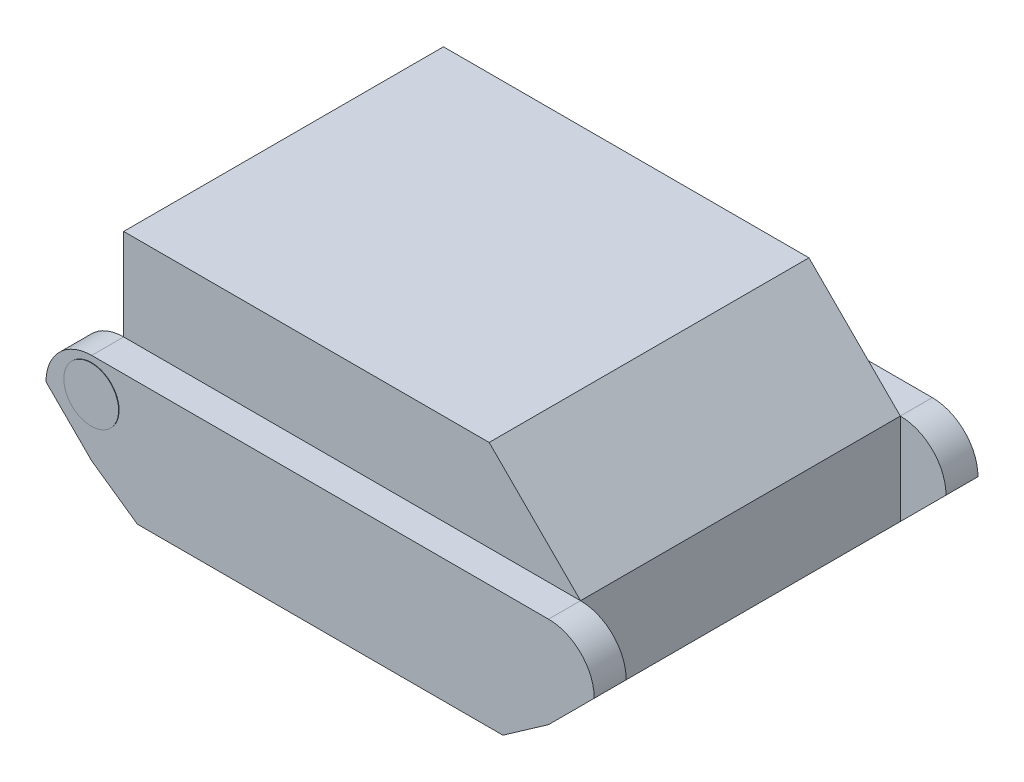
ISO-10303-21;
HEADER;
FILE_DESCRIPTION(('STEP AP214'),'2;1');
FILE_NAME('part.step','',(''),(''),'','','');
FILE_SCHEMA(('AUTOMOTIVE_DESIGN { 1 0 10303 214 1 1 1 1 }'));
ENDSEC;
DATA;
#1=APPLICATION_CONTEXT('core data for automotive mechanical design processes');
#2=APPLICATION_PROTOCOL_DEFINITION('international standard','automotive_design',2000,#1);
#3=PRODUCT_CONTEXT('',#1,'mechanical');
#4=PRODUCT('Part','Part','',(#3));
#5=PRODUCT_RELATED_PRODUCT_CATEGORY('part','',(#4));
#6=PRODUCT_DEFINITION_FORMATION('','',#4);
#7=PRODUCT_DEFINITION_CONTEXT('part definition',#1,'design');
#8=PRODUCT_DEFINITION('design','',#6,#7);
#9=PRODUCT_DEFINITION_SHAPE('','',#8);
#10=(LENGTH_UNIT() NAMED_UNIT(*) SI_UNIT(.MILLI.,.METRE.));
#11=(NAMED_UNIT(*) PLANE_ANGLE_UNIT() SI_UNIT($,.RADIAN.));
#12=(NAMED_UNIT(*) SI_UNIT($,.STERADIAN.) SOLID_ANGLE_UNIT());
#13=UNCERTAINTY_MEASURE_WITH_UNIT(LENGTH_MEASURE(1.E-05),#10,'distance_accuracy_value','');
#14=(GEOMETRIC_REPRESENTATION_CONTEXT(3) GLOBAL_UNCERTAINTY_ASSIGNED_CONTEXT((#13)) GLOBAL_UNIT_ASSIGNED_CONTEXT((#10,
#11,#12)) REPRESENTATION_CONTEXT('',''));
#15=CARTESIAN_POINT('',(0.,0.,0.));
#16=DIRECTION('',(0.,0.,1.));
#17=DIRECTION('',(1.,0.,0.));
#18=AXIS2_PLACEMENT_3D('',#15,#16,#17);
#19=CARTESIAN_POINT('',(-2.85897556390974,-98.560009332196,77.));
#20=DIRECTION('',(0.,0.,1.));
#21=DIRECTION('',(1.,0.,0.));
#22=AXIS2_PLACEMENT_3D('',#19,#20,#21);
#23=PLANE('',#22);
#24=DIRECTION('',(1.,0.,0.));
#25=VECTOR('',#24,1.);
#26=CARTESIAN_POINT('',(-2.85897556390974,-19.6239756367663,77.));
#27=LINE('',#26,#25);
#28=CARTESIAN_POINT('',(-42.8589755639098,-19.6239756367663,77.));
#29=VERTEX_POINT('',#28);
#30=CARTESIAN_POINT('',(37.1410244360903,-19.6239756367663,77.));
#31=VERTEX_POINT('',#30);
#32=EDGE_CURVE('E177',#29,#31,#27,.T.);
#33=ORIENTED_EDGE('',*,*,#32,.T.);
#34=DIRECTION('',(0.819231920519041,0.573462344363328,0.));
#35=VECTOR('',#34,1.);
#36=CARTESIAN_POINT('',(-26.7886558235076,-64.3747518184848,77.));
#37=LINE('',#36,#35);
#38=CARTESIAN_POINT('',(47.1410244360903,-12.6239756367663,77.));
#39=VERTEX_POINT('',#38);
#40=EDGE_CURVE('E165',#31,#39,#37,.T.);
#41=ORIENTED_EDGE('',*,*,#40,.T.);
#42=DIRECTION('',(0.707106781186548,0.707106781186548,0.));
#43=VECTOR('',#42,1.);
#44=CARTESIAN_POINT('',(-20.8269924116246,-80.5919924844812,77.));
#45=LINE('',#44,#43);
#46=CARTESIAN_POINT('',(57.1410244360903,-2.62397563676636,77.));
#47=VERTEX_POINT('',#46);
#48=EDGE_CURVE('E176',#39,#47,#45,.T.);
#49=ORIENTED_EDGE('',*,*,#48,.T.);
#50=CARTESIAN_POINT('',(47.1410244360903,-2.62397563676634,77.));
#51=DIRECTION('',(0.,0.,1.));
#52=DIRECTION('',(1.,0.,0.));
#53=AXIS2_PLACEMENT_3D('',#50,#51,#52);
#54=CIRCLE('',#53,10.);
#55=CARTESIAN_POINT('',(47.1410244360903,7.37602436323367,77.));
#56=VERTEX_POINT('',#55);
#57=EDGE_CURVE('E391',#56,#47,#54,.F.);
#58=ORIENTED_EDGE('',*,*,#57,.F.);
#59=DIRECTION('',(1.,0.,0.));
#60=VECTOR('',#59,1.);
#61=CARTESIAN_POINT('',(-2.85897556390974,7.37602436323366,77.));
#62=LINE('',#61,#60);
#63=CARTESIAN_POINT('',(-52.8589755639098,7.37602436323366,77.));
#64=VERTEX_POINT('',#63);
#65=EDGE_CURVE('E439',#64,#56,#62,.T.);
#66=ORIENTED_EDGE('',*,*,#65,.F.);
#67=CARTESIAN_POINT('',(-52.8589755639098,-2.62397563676634,77.));
#68=DIRECTION('',(0.,0.,1.));
#69=DIRECTION('',(1.,0.,0.));
#70=AXIS2_PLACEMENT_3D('',#67,#68,#69);
#71=CIRCLE('',#70,10.);
#72=CARTESIAN_POINT('',(-62.8589755639098,-2.62397563676635,77.));
#73=VERTEX_POINT('',#72);
#74=EDGE_CURVE('E442',#64,#73,#71,.T.);
#75=ORIENTED_EDGE('',*,*,#74,.T.);
#76=DIRECTION('',(0.707106781186548,-0.707106781186548,0.));
#77=VECTOR('',#76,1.);
#78=CARTESIAN_POINT('',(15.1090412838051,-80.5919924844812,77.));
#79=LINE('',#78,#77);
#80=CARTESIAN_POINT('',(-52.8589755639097,-12.6239756367663,77.));
#81=VERTEX_POINT('',#80);
#82=EDGE_CURVE('E444',#73,#81,#79,.T.);
#83=ORIENTED_EDGE('',*,*,#82,.T.);
#84=DIRECTION('',(0.81923192051904,-0.573462344363329,0.));
#85=VECTOR('',#84,1.);
#86=CARTESIAN_POINT('',(21.0707046956881,-64.3747518184849,77.));
#87=LINE('',#86,#85);
#88=EDGE_CURVE('E182',#81,#29,#87,.T.);
#89=ORIENTED_EDGE('',*,*,#88,.T.);
#90=EDGE_LOOP('',(#33,#41,#49,#58,#66,#75,#83,#89));
#91=FACE_BOUND('',#90,.T.);
#92=CARTESIAN_POINT('',(-52.8589755639098,0.,77.));
#93=DIRECTION('',(0.,0.,1.));
#94=DIRECTION('',(1.,0.,0.));
#95=AXIS2_PLACEMENT_3D('',#92,#93,#94);
#96=CIRCLE('',#95,5.9977823607704);
#97=CARTESIAN_POINT('',(-46.8611932031394,0.,77.));
#98=VERTEX_POINT('',#97);
#99=EDGE_CURVE('E431',#98,#98,#96,.T.);
#100=ORIENTED_EDGE('',*,*,#99,.F.);
#101=EDGE_LOOP('',(#100));
#102=FACE_BOUND('',#101,.T.);
#103=ADVANCED_FACE('F39',(#91,#102),#23,.T.);
#104=CARTESIAN_POINT('',(-52.8589755639097,-12.6239756367663,70.));
#105=DIRECTION('',(0.,0.,1.));
#106=DIRECTION('',(1.,0.,0.));
#107=AXIS2_PLACEMENT_3D('',#104,#105,#106);
#108=PLANE('',#107);
#109=DIRECTION('',(0.,-1.,0.));
#110=VECTOR('',#109,1.);
#111=CARTESIAN_POINT('',(-52.8589755639098,27.3760243632337,70.));
#112=LINE('',#111,#110);
#113=CARTESIAN_POINT('',(-52.8589755639098,27.3760243632337,70.));
#114=VERTEX_POINT('',#113);
#115=CARTESIAN_POINT('',(-52.8589755639098,7.37602436323366,70.));
#116=VERTEX_POINT('',#115);
#117=EDGE_CURVE('E265',#114,#116,#112,.T.);
#118=ORIENTED_EDGE('',*,*,#117,.T.);
#119=DIRECTION('',(1.,0.,0.));
#120=VECTOR('',#119,1.);
#121=CARTESIAN_POINT('',(-2.85897556390974,7.37602436323366,70.));
#122=LINE('',#121,#120);
#123=CARTESIAN_POINT('',(47.1410244360903,7.37602436323367,70.));
#124=VERTEX_POINT('',#123);
#125=EDGE_CURVE('E358',#116,#124,#122,.T.);
#126=ORIENTED_EDGE('',*,*,#125,.T.);
#127=DIRECTION('',(-0.707106781186548,0.707106781186547,0.));
#128=VECTOR('',#127,1.);
#129=CARTESIAN_POINT('',(7.14102443609024,47.3760243632337,70.));
#130=LINE('',#129,#128);
#131=CARTESIAN_POINT('',(27.1410244360902,27.3760243632337,70.));
#132=VERTEX_POINT('',#131);
#133=EDGE_CURVE('E62',#124,#132,#130,.T.);
#134=ORIENTED_EDGE('',*,*,#133,.T.);
#135=DIRECTION('',(-1.,0.,0.));
#136=VECTOR('',#135,1.);
#137=CARTESIAN_POINT('',(-52.8589755639098,27.3760243632337,70.));
#138=LINE('',#137,#136);
#139=EDGE_CURVE('E274',#132,#114,#138,.T.);
#140=ORIENTED_EDGE('',*,*,#139,.T.);
#141=EDGE_LOOP('',(#118,#126,#134,#140));
#142=FACE_BOUND('',#141,.T.);
#143=ADVANCED_FACE('F356',(#142),#108,.T.);
#144=CARTESIAN_POINT('',(47.1410244360902,27.3760243632337,70.));
#145=DIRECTION('',(-1.,0.,0.));
#146=DIRECTION('',(0.,-1.,0.));
#147=AXIS2_PLACEMENT_3D('',#144,#145,#146);
#148=PLANE('',#147);
#149=DIRECTION('',(0.,0.,-1.));
#150=VECTOR('',#149,1.);
#151=CARTESIAN_POINT('',(47.1410244360903,7.37602436323366,318.065407233314));
#152=LINE('',#151,#150);
#153=CARTESIAN_POINT('',(47.1410244360902,7.37602436323367,0.));
#154=VERTEX_POINT('',#153);
#155=EDGE_CURVE('E258',#124,#154,#152,.T.);
#156=ORIENTED_EDGE('',*,*,#155,.F.);
#157=DIRECTION('',(0.,1.,0.));
#158=VECTOR('',#157,1.);
#159=CARTESIAN_POINT('',(47.1410244360902,27.3760243632337,70.));
#160=LINE('',#159,#158);
#161=CARTESIAN_POINT('',(47.1410244360903,-12.6239756367663,70.));
#162=VERTEX_POINT('',#161);
#163=EDGE_CURVE('E271',#162,#124,#160,.T.);
#164=ORIENTED_EDGE('',*,*,#163,.F.);
#165=DIRECTION('',(0.,0.,-1.));
#166=VECTOR('',#165,1.);
#167=CARTESIAN_POINT('',(47.1410244360903,-12.6239756367663,70.));
#168=LINE('',#167,#166);
#169=CARTESIAN_POINT('',(47.1410244360903,-12.6239756367663,0.));
#170=VERTEX_POINT('',#169);
#171=EDGE_CURVE('E290',#162,#170,#168,.T.);
#172=ORIENTED_EDGE('',*,*,#171,.T.);
#173=DIRECTION('',(0.,1.,0.));
#174=VECTOR('',#173,1.);
#175=CARTESIAN_POINT('',(47.1410244360902,27.3760243632337,0.));
#176=LINE('',#175,#174);
#177=EDGE_CURVE('E283',#170,#154,#176,.T.);
#178=ORIENTED_EDGE('',*,*,#177,.T.);
#179=EDGE_LOOP('',(#156,#164,#172,#178));
#180=FACE_BOUND('',#179,.T.);
#181=ADVANCED_FACE('F348',(#180),#148,.F.);
#182=CARTESIAN_POINT('',(-52.8589755639098,27.3760243632337,70.));
#183=DIRECTION('',(0.,-1.,0.));
#184=DIRECTION('',(0.,0.,-1.));
#185=AXIS2_PLACEMENT_3D('',#182,#183,#184);
#186=PLANE('',#185);
#187=DIRECTION('',(0.,0.,-1.));
#188=VECTOR('',#187,1.);
#189=CARTESIAN_POINT('',(27.1410244360903,27.3760243632337,318.065407233314));
#190=LINE('',#189,#188);
#191=CARTESIAN_POINT('',(27.1410244360903,27.3760243632337,0.));
#192=VERTEX_POINT('',#191);
#193=EDGE_CURVE('E257',#132,#192,#190,.T.);
#194=ORIENTED_EDGE('',*,*,#193,.T.);
#195=DIRECTION('',(-1.,0.,0.));
#196=VECTOR('',#195,1.);
#197=CARTESIAN_POINT('',(-52.8589755639098,27.3760243632337,0.));
#198=LINE('',#197,#196);
#199=CARTESIAN_POINT('',(-52.8589755639098,27.3760243632337,0.));
#200=VERTEX_POINT('',#199);
#201=EDGE_CURVE('E286',#192,#200,#198,.T.);
#202=ORIENTED_EDGE('',*,*,#201,.T.);
#203=DIRECTION('',(0.,0.,-1.));
#204=VECTOR('',#203,1.);
#205=CARTESIAN_POINT('',(-52.8589755639098,27.3760243632337,70.));
#206=LINE('',#205,#204);
#207=EDGE_CURVE('E276',#114,#200,#206,.T.);
#208=ORIENTED_EDGE('',*,*,#207,.F.);
#209=ORIENTED_EDGE('',*,*,#139,.F.);
#210=EDGE_LOOP('',(#194,#202,#208,#209));
#211=FACE_BOUND('',#210,.T.);
#212=ADVANCED_FACE('F354',(#211),#186,.F.);
#213=CARTESIAN_POINT('',(-52.8589755639097,-12.6239756367663,0.));
#214=DIRECTION('',(0.,0.,1.));
#215=DIRECTION('',(1.,0.,0.));
#216=AXIS2_PLACEMENT_3D('',#213,#214,#215);
#217=PLANE('',#216);
#218=DIRECTION('',(-0.707106781186548,0.707106781186547,0.));
#219=VECTOR('',#218,1.);
#220=CARTESIAN_POINT('',(7.14102443609024,47.3760243632337,0.));
#221=LINE('',#220,#219);
#222=EDGE_CURVE('E11',#154,#192,#221,.T.);
#223=ORIENTED_EDGE('',*,*,#222,.F.);
#224=DIRECTION('',(-1.,0.,0.));
#225=VECTOR('',#224,1.);
#226=CARTESIAN_POINT('',(-108.795009259339,7.37602436323367,0.));
#227=LINE('',#226,#225);
#228=CARTESIAN_POINT('',(-52.8589755639097,7.37602436323367,0.));
#229=VERTEX_POINT('',#228);
#230=EDGE_CURVE('E228',#154,#229,#227,.T.);
#231=ORIENTED_EDGE('',*,*,#230,.T.);
#232=DIRECTION('',(0.,-1.,0.));
#233=VECTOR('',#232,1.);
#234=CARTESIAN_POINT('',(-52.8589755639098,27.3760243632337,0.));
#235=LINE('',#234,#233);
#236=EDGE_CURVE('E277',#200,#229,#235,.T.);
#237=ORIENTED_EDGE('',*,*,#236,.F.);
#238=ORIENTED_EDGE('',*,*,#201,.F.);
#239=EDGE_LOOP('',(#223,#231,#237,#238));
#240=FACE_BOUND('',#239,.T.);
#241=ADVANCED_FACE('F310',(#240),#217,.F.);
#242=CARTESIAN_POINT('',(-52.8589755639098,27.3760243632337,70.));
#243=DIRECTION('',(1.,0.,0.));
#244=DIRECTION('',(0.,1.,0.));
#245=AXIS2_PLACEMENT_3D('',#242,#243,#244);
#246=PLANE('',#245);
#247=ORIENTED_EDGE('',*,*,#236,.T.);
#248=CARTESIAN_POINT('',(-52.8589755639097,-12.6239756367663,0.));
#249=VERTEX_POINT('',#248);
#250=EDGE_CURVE('E264',#229,#249,#235,.T.);
#251=ORIENTED_EDGE('',*,*,#250,.T.);
#252=DIRECTION('',(0.,0.,-1.));
#253=VECTOR('',#252,1.);
#254=CARTESIAN_POINT('',(-52.8589755639097,-12.6239756367663,70.));
#255=LINE('',#254,#253);
#256=CARTESIAN_POINT('',(-52.8589755639097,-12.6239756367663,70.));
#257=VERTEX_POINT('',#256);
#258=EDGE_CURVE('E47',#257,#249,#255,.T.);
#259=ORIENTED_EDGE('',*,*,#258,.F.);
#260=EDGE_CURVE('E269',#116,#257,#112,.T.);
#261=ORIENTED_EDGE('',*,*,#260,.F.);
#262=ORIENTED_EDGE('',*,*,#117,.F.);
#263=ORIENTED_EDGE('',*,*,#207,.T.);
#264=EDGE_LOOP('',(#247,#251,#259,#261,#262,#263));
#265=FACE_BOUND('',#264,.T.);
#266=ADVANCED_FACE('F41',(#265),#246,.F.);
#267=CARTESIAN_POINT('',(-52.8589755639097,-12.6239756367663,70.));
#268=DIRECTION('',(0.,1.,0.));
#269=DIRECTION('',(0.,0.,1.));
#270=AXIS2_PLACEMENT_3D('',#267,#268,#269);
#271=PLANE('',#270);
#272=DIRECTION('',(1.,0.,0.));
#273=VECTOR('',#272,1.);
#274=CARTESIAN_POINT('',(-52.8589755639097,-12.6239756367663,0.));
#275=LINE('',#274,#273);
#276=EDGE_CURVE('E280',#249,#170,#275,.T.);
#277=ORIENTED_EDGE('',*,*,#276,.T.);
#278=ORIENTED_EDGE('',*,*,#171,.F.);
#279=DIRECTION('',(1.,0.,0.));
#280=VECTOR('',#279,1.);
#281=CARTESIAN_POINT('',(-52.8589755639097,-12.6239756367663,70.));
#282=LINE('',#281,#280);
#283=EDGE_CURVE('E268',#257,#162,#282,.T.);
#284=ORIENTED_EDGE('',*,*,#283,.F.);
#285=ORIENTED_EDGE('',*,*,#258,.T.);
#286=EDGE_LOOP('',(#277,#278,#284,#285));
#287=FACE_BOUND('',#286,.T.);
#288=ADVANCED_FACE('F296',(#287),#271,.F.);
#289=CARTESIAN_POINT('',(27.1410244360903,27.3760243632337,318.065407233314));
#290=DIRECTION('',(0.707106781186547,0.707106781186548,0.));
#291=DIRECTION('',(-0.707106781186548,0.707106781186547,0.));
#292=AXIS2_PLACEMENT_3D('',#289,#290,#291);
#293=PLANE('',#292);
#294=ORIENTED_EDGE('',*,*,#133,.F.);
#295=ORIENTED_EDGE('',*,*,#155,.T.);
#296=ORIENTED_EDGE('',*,*,#222,.T.);
#297=ORIENTED_EDGE('',*,*,#193,.F.);
#298=EDGE_LOOP('',(#294,#295,#296,#297));
#299=FACE_BOUND('',#298,.T.);
#300=ADVANCED_FACE('F351',(#299),#293,.T.);
#301=CARTESIAN_POINT('',(-108.795009259339,7.37602436323367,0.));
#302=DIRECTION('',(0.,0.,-1.));
#303=DIRECTION('',(-1.,0.,0.));
#304=AXIS2_PLACEMENT_3D('',#301,#302,#303);
#305=PLANE('',#304);
#306=ORIENTED_EDGE('',*,*,#177,.F.);
#307=DIRECTION('',(-0.707106781186548,-0.707106781186547,0.));
#308=VECTOR('',#307,1.);
#309=CARTESIAN_POINT('',(-20.8269924116246,-80.5919924844812,0.));
#310=LINE('',#309,#308);
#311=CARTESIAN_POINT('',(57.1410244360903,-2.62397563676636,0.));
#312=VERTEX_POINT('',#311);
#313=EDGE_CURVE('E233',#312,#170,#310,.T.);
#314=ORIENTED_EDGE('',*,*,#313,.F.);
#315=CARTESIAN_POINT('',(47.1410244360903,-2.62397563676633,0.));
#316=DIRECTION('',(0.,0.,-1.));
#317=DIRECTION('',(-1.,0.,0.));
#318=AXIS2_PLACEMENT_3D('',#315,#316,#317);
#319=CIRCLE('',#318,10.);
#320=EDGE_CURVE('E231',#154,#312,#319,.T.);
#321=ORIENTED_EDGE('',*,*,#320,.F.);
#322=EDGE_LOOP('',(#306,#314,#321));
#323=FACE_BOUND('',#322,.T.);
#324=ADVANCED_FACE('F345',(#323),#305,.F.);
#325=ORIENTED_EDGE('',*,*,#276,.F.);
#326=DIRECTION('',(-0.81923192051904,0.573462344363329,0.));
#327=VECTOR('',#326,1.);
#328=CARTESIAN_POINT('',(-99.7959109299699,20.2318791194758,0.));
#329=LINE('',#328,#327);
#330=CARTESIAN_POINT('',(-42.8589755639098,-19.6239756367663,0.));
#331=VERTEX_POINT('',#330);
#332=EDGE_CURVE('E194',#331,#249,#329,.T.);
#333=ORIENTED_EDGE('',*,*,#332,.F.);
#334=DIRECTION('',(-1.,0.,0.));
#335=VECTOR('',#334,1.);
#336=CARTESIAN_POINT('',(-108.795009259339,-19.6239756367663,0.));
#337=LINE('',#336,#335);
#338=CARTESIAN_POINT('',(37.1410244360903,-19.6239756367664,0.));
#339=VERTEX_POINT('',#338);
#340=EDGE_CURVE('E191',#339,#331,#337,.T.);
#341=ORIENTED_EDGE('',*,*,#340,.F.);
#342=DIRECTION('',(-0.81923192051904,-0.573462344363329,0.));
#343=VECTOR('',#342,1.);
#344=CARTESIAN_POINT('',(-48.1180585809766,-79.3053337487132,0.));
#345=LINE('',#344,#343);
#346=EDGE_CURVE('E204',#170,#339,#345,.T.);
#347=ORIENTED_EDGE('',*,*,#346,.F.);
#348=EDGE_LOOP('',(#325,#333,#341,#347));
#349=FACE_BOUND('',#348,.T.);
#350=ADVANCED_FACE('F328',(#349),#305,.F.);
#351=CARTESIAN_POINT('',(-108.795009259339,-19.6239756367663,-7.));
#352=DIRECTION('',(0.,1.,0.));
#353=DIRECTION('',(0.,0.,1.));
#354=AXIS2_PLACEMENT_3D('',#351,#352,#353);
#355=PLANE('',#354);
#356=ORIENTED_EDGE('',*,*,#340,.T.);
#357=DIRECTION('',(0.,0.,1.));
#358=VECTOR('',#357,1.);
#359=CARTESIAN_POINT('',(-42.8589755639098,-19.6239756367663,-7.));
#360=LINE('',#359,#358);
#361=CARTESIAN_POINT('',(-42.8589755639098,-19.6239756367663,-7.));
#362=VERTEX_POINT('',#361);
#363=EDGE_CURVE('E254',#362,#331,#360,.T.);
#364=ORIENTED_EDGE('',*,*,#363,.F.);
#365=DIRECTION('',(-1.,0.,0.));
#366=VECTOR('',#365,1.);
#367=CARTESIAN_POINT('',(-108.795009259339,-19.6239756367663,-7.));
#368=LINE('',#367,#366);
#369=CARTESIAN_POINT('',(37.1410244360903,-19.6239756367664,-7.));
#370=VERTEX_POINT('',#369);
#371=EDGE_CURVE('E200',#370,#362,#368,.T.);
#372=ORIENTED_EDGE('',*,*,#371,.F.);
#373=DIRECTION('',(0.,0.,1.));
#374=VECTOR('',#373,1.);
#375=CARTESIAN_POINT('',(37.1410244360903,-19.6239756367664,-7.));
#376=LINE('',#375,#374);
#377=EDGE_CURVE('E220',#370,#339,#376,.T.);
#378=ORIENTED_EDGE('',*,*,#377,.T.);
#379=EDGE_LOOP('',(#356,#364,#372,#378));
#380=FACE_BOUND('',#379,.T.);
#381=ADVANCED_FACE('F337',(#380),#355,.F.);
#382=CARTESIAN_POINT('',(-99.7959109299699,20.2318791194758,-7.));
#383=DIRECTION('',(0.573462344363329,0.81923192051904,0.));
#384=DIRECTION('',(-0.81923192051904,0.573462344363329,0.));
#385=AXIS2_PLACEMENT_3D('',#382,#383,#384);
#386=PLANE('',#385);
#387=ORIENTED_EDGE('',*,*,#332,.T.);
#388=DIRECTION('',(0.,0.,1.));
#389=VECTOR('',#388,1.);
#390=CARTESIAN_POINT('',(-52.8589755639097,-12.6239756367663,-7.));
#391=LINE('',#390,#389);
#392=CARTESIAN_POINT('',(-52.8589755639097,-12.6239756367663,-7.));
#393=VERTEX_POINT('',#392);
#394=EDGE_CURVE('E251',#393,#249,#391,.T.);
#395=ORIENTED_EDGE('',*,*,#394,.F.);
#396=DIRECTION('',(-0.81923192051904,0.573462344363329,0.));
#397=VECTOR('',#396,1.);
#398=CARTESIAN_POINT('',(-99.7959109299699,20.2318791194758,-7.));
#399=LINE('',#398,#397);
#400=EDGE_CURVE('E203',#362,#393,#399,.T.);
#401=ORIENTED_EDGE('',*,*,#400,.F.);
#402=ORIENTED_EDGE('',*,*,#363,.T.);
#403=EDGE_LOOP('',(#387,#395,#401,#402));
#404=FACE_BOUND('',#403,.T.);
#405=ADVANCED_FACE('F324',(#404),#386,.F.);
#406=CARTESIAN_POINT('',(-90.8269924116246,25.3440412109485,-7.));
#407=DIRECTION('',(-0.707106781186548,-0.707106781186548,0.));
#408=DIRECTION('',(0.707106781186547,-0.707106781186548,0.));
#409=AXIS2_PLACEMENT_3D('',#406,#407,#408);
#410=PLANE('',#409);
#411=DIRECTION('',(0.707106781186547,-0.707106781186548,0.));
#412=VECTOR('',#411,1.);
#413=CARTESIAN_POINT('',(-90.8269924116246,25.3440412109485,0.));
#414=LINE('',#413,#412);
#415=CARTESIAN_POINT('',(-62.8589755639097,-2.62397563676633,0.));
#416=VERTEX_POINT('',#415);
#417=EDGE_CURVE('E224',#416,#249,#414,.T.);
#418=ORIENTED_EDGE('',*,*,#417,.F.);
#419=DIRECTION('',(0.,0.,1.));
#420=VECTOR('',#419,1.);
#421=CARTESIAN_POINT('',(-62.8589755639097,-2.62397563676633,-7.));
#422=LINE('',#421,#420);
#423=CARTESIAN_POINT('',(-62.8589755639097,-2.62397563676633,-7.));
#424=VERTEX_POINT('',#423);
#425=EDGE_CURVE('E249',#424,#416,#422,.T.);
#426=ORIENTED_EDGE('',*,*,#425,.F.);
#427=DIRECTION('',(0.707106781186547,-0.707106781186548,0.));
#428=VECTOR('',#427,1.);
#429=CARTESIAN_POINT('',(-90.8269924116246,25.3440412109485,-7.));
#430=LINE('',#429,#428);
#431=EDGE_CURVE('E206',#424,#393,#430,.T.);
#432=ORIENTED_EDGE('',*,*,#431,.T.);
#433=ORIENTED_EDGE('',*,*,#394,.T.);
#434=EDGE_LOOP('',(#418,#426,#432,#433));
#435=FACE_BOUND('',#434,.T.);
#436=ADVANCED_FACE('F322',(#435),#410,.T.);
#437=CARTESIAN_POINT('',(-52.8589755639097,-2.62397563676633,-7.));
#438=DIRECTION('',(0.,0.,1.));
#439=DIRECTION('',(1.,0.,0.));
#440=AXIS2_PLACEMENT_3D('',#437,#438,#439);
#441=CYLINDRICAL_SURFACE('',#440,10.);
#442=CARTESIAN_POINT('',(-52.8589755639097,-2.62397563676633,0.));
#443=DIRECTION('',(0.,0.,-1.));
#444=DIRECTION('',(-1.,0.,0.));
#445=AXIS2_PLACEMENT_3D('',#442,#443,#444);
#446=CIRCLE('',#445,10.);
#447=EDGE_CURVE('E54',#229,#416,#446,.F.);
#448=ORIENTED_EDGE('',*,*,#447,.F.);
#449=DIRECTION('',(0.,0.,1.));
#450=VECTOR('',#449,1.);
#451=CARTESIAN_POINT('',(-52.8589755639098,7.37602436323367,-7.));
#452=LINE('',#451,#450);
#453=CARTESIAN_POINT('',(-52.8589755639098,7.37602436323367,-7.));
#454=VERTEX_POINT('',#453);
#455=EDGE_CURVE('E247',#454,#229,#452,.T.);
#456=ORIENTED_EDGE('',*,*,#455,.F.);
#457=CARTESIAN_POINT('',(-52.8589755639097,-2.62397563676633,-7.));
#458=DIRECTION('',(0.,0.,-1.));
#459=DIRECTION('',(-1.,0.,0.));
#460=AXIS2_PLACEMENT_3D('',#457,#458,#459);
#461=CIRCLE('',#460,10.);
#462=EDGE_CURVE('E209',#454,#424,#461,.F.);
#463=ORIENTED_EDGE('',*,*,#462,.T.);
#464=ORIENTED_EDGE('',*,*,#425,.T.);
#465=EDGE_LOOP('',(#448,#456,#463,#464));
#466=FACE_BOUND('',#465,.T.);
#467=ADVANCED_FACE('F316',(#466),#441,.T.);
#468=CARTESIAN_POINT('',(-108.795009259339,7.37602436323367,-7.));
#469=DIRECTION('',(0.,1.,0.));
#470=DIRECTION('',(0.,0.,1.));
#471=AXIS2_PLACEMENT_3D('',#468,#469,#470);
#472=PLANE('',#471);
#473=ORIENTED_EDGE('',*,*,#230,.F.);
#474=DIRECTION('',(0.,0.,1.));
#475=VECTOR('',#474,1.);
#476=CARTESIAN_POINT('',(47.1410244360902,7.37602436323367,-7.));
#477=LINE('',#476,#475);
#478=CARTESIAN_POINT('',(47.1410244360902,7.37602436323367,-7.));
#479=VERTEX_POINT('',#478);
#480=EDGE_CURVE('E245',#479,#154,#477,.T.);
#481=ORIENTED_EDGE('',*,*,#480,.F.);
#482=DIRECTION('',(-1.,0.,0.));
#483=VECTOR('',#482,1.);
#484=CARTESIAN_POINT('',(-108.795009259339,7.37602436323367,-7.));
#485=LINE('',#484,#483);
#486=EDGE_CURVE('E212',#479,#454,#485,.T.);
#487=ORIENTED_EDGE('',*,*,#486,.T.);
#488=ORIENTED_EDGE('',*,*,#455,.T.);
#489=EDGE_LOOP('',(#473,#481,#487,#488));
#490=FACE_BOUND('',#489,.T.);
#491=ADVANCED_FACE('F312',(#490),#472,.T.);
#492=CARTESIAN_POINT('',(47.1410244360903,-2.62397563676633,-7.));
#493=DIRECTION('',(0.,0.,1.));
#494=DIRECTION('',(1.,0.,0.));
#495=AXIS2_PLACEMENT_3D('',#492,#493,#494);
#496=CYLINDRICAL_SURFACE('',#495,10.);
#497=ORIENTED_EDGE('',*,*,#320,.T.);
#498=DIRECTION('',(0.,0.,1.));
#499=VECTOR('',#498,1.);
#500=CARTESIAN_POINT('',(57.1410244360903,-2.62397563676636,-7.));
#501=LINE('',#500,#499);
#502=CARTESIAN_POINT('',(57.1410244360903,-2.62397563676636,-7.));
#503=VERTEX_POINT('',#502);
#504=EDGE_CURVE('E242',#503,#312,#501,.T.);
#505=ORIENTED_EDGE('',*,*,#504,.F.);
#506=CARTESIAN_POINT('',(47.1410244360903,-2.62397563676633,-7.));
#507=DIRECTION('',(0.,0.,-1.));
#508=DIRECTION('',(-1.,0.,0.));
#509=AXIS2_PLACEMENT_3D('',#506,#507,#508);
#510=CIRCLE('',#509,10.);
#511=EDGE_CURVE('E215',#479,#503,#510,.T.);
#512=ORIENTED_EDGE('',*,*,#511,.F.);
#513=ORIENTED_EDGE('',*,*,#480,.T.);
#514=EDGE_LOOP('',(#497,#505,#512,#513));
#515=FACE_BOUND('',#514,.T.);
#516=ADVANCED_FACE('F483',(#515),#496,.T.);
#517=CARTESIAN_POINT('',(-20.8269924116246,-80.5919924844812,-7.));
#518=DIRECTION('',(-0.707106781186547,0.707106781186548,0.));
#519=DIRECTION('',(-0.707106781186548,-0.707106781186547,0.));
#520=AXIS2_PLACEMENT_3D('',#517,#518,#519);
#521=PLANE('',#520);
#522=ORIENTED_EDGE('',*,*,#313,.T.);
#523=DIRECTION('',(0.,0.,1.));
#524=VECTOR('',#523,1.);
#525=CARTESIAN_POINT('',(47.1410244360903,-12.6239756367663,-7.));
#526=LINE('',#525,#524);
#527=CARTESIAN_POINT('',(47.1410244360903,-12.6239756367663,-7.));
#528=VERTEX_POINT('',#527);
#529=EDGE_CURVE('E239',#528,#170,#526,.T.);
#530=ORIENTED_EDGE('',*,*,#529,.F.);
#531=DIRECTION('',(-0.707106781186548,-0.707106781186547,0.));
#532=VECTOR('',#531,1.);
#533=CARTESIAN_POINT('',(-20.8269924116246,-80.5919924844812,-7.));
#534=LINE('',#533,#532);
#535=EDGE_CURVE('E217',#503,#528,#534,.T.);
#536=ORIENTED_EDGE('',*,*,#535,.F.);
#537=ORIENTED_EDGE('',*,*,#504,.T.);
#538=EDGE_LOOP('',(#522,#530,#536,#537));
#539=FACE_BOUND('',#538,.T.);
#540=ADVANCED_FACE('F341',(#539),#521,.F.);
#541=CARTESIAN_POINT('',(-48.1180585809766,-79.3053337487132,-7.));
#542=DIRECTION('',(-0.573462344363329,0.81923192051904,0.));
#543=DIRECTION('',(-0.81923192051904,-0.573462344363329,0.));
#544=AXIS2_PLACEMENT_3D('',#541,#542,#543);
#545=PLANE('',#544);
#546=ORIENTED_EDGE('',*,*,#346,.T.);
#547=ORIENTED_EDGE('',*,*,#377,.F.);
#548=DIRECTION('',(-0.81923192051904,-0.573462344363329,0.));
#549=VECTOR('',#548,1.);
#550=CARTESIAN_POINT('',(-48.1180585809766,-79.3053337487132,-7.));
#551=LINE('',#550,#549);
#552=EDGE_CURVE('E219',#528,#370,#551,.T.);
#553=ORIENTED_EDGE('',*,*,#552,.F.);
#554=ORIENTED_EDGE('',*,*,#529,.T.);
#555=EDGE_LOOP('',(#546,#547,#553,#554));
#556=FACE_BOUND('',#555,.T.);
#557=ADVANCED_FACE('F332',(#556),#545,.F.);
#558=CARTESIAN_POINT('',(-108.795009259339,7.37602436323367,-7.));
#559=DIRECTION('',(0.,0.,-1.));
#560=DIRECTION('',(-1.,0.,0.));
#561=AXIS2_PLACEMENT_3D('',#558,#559,#560);
#562=PLANE('',#561);
#563=ORIENTED_EDGE('',*,*,#371,.T.);
#564=ORIENTED_EDGE('',*,*,#400,.T.);
#565=ORIENTED_EDGE('',*,*,#431,.F.);
#566=ORIENTED_EDGE('',*,*,#462,.F.);
#567=ORIENTED_EDGE('',*,*,#486,.F.);
#568=ORIENTED_EDGE('',*,*,#511,.T.);
#569=ORIENTED_EDGE('',*,*,#535,.T.);
#570=ORIENTED_EDGE('',*,*,#552,.T.);
#571=EDGE_LOOP('',(#563,#564,#565,#566,#567,#568,#569,#570));
#572=FACE_BOUND('',#571,.T.);
#573=ADVANCED_FACE('F319',(#572),#562,.T.);
#574=ORIENTED_EDGE('',*,*,#250,.F.);
#575=ORIENTED_EDGE('',*,*,#447,.T.);
#576=ORIENTED_EDGE('',*,*,#417,.T.);
#577=EDGE_LOOP('',(#574,#575,#576));
#578=FACE_BOUND('',#577,.T.);
#579=ADVANCED_FACE('F305',(#578),#305,.F.);
#580=CARTESIAN_POINT('',(-2.85897556390974,-98.560009332196,70.));
#581=DIRECTION('',(0.,0.,1.));
#582=DIRECTION('',(1.,0.,0.));
#583=AXIS2_PLACEMENT_3D('',#580,#581,#582);
#584=PLANE('',#583);
#585=DIRECTION('',(0.707106781186548,0.707106781186548,0.));
#586=VECTOR('',#585,1.);
#587=CARTESIAN_POINT('',(-20.8269924116246,-80.5919924844812,70.));
#588=LINE('',#587,#586);
#589=CARTESIAN_POINT('',(57.1410244360903,-2.62397563676636,70.));
#590=VERTEX_POINT('',#589);
#591=EDGE_CURVE('E367',#162,#590,#588,.T.);
#592=ORIENTED_EDGE('',*,*,#591,.F.);
#593=ORIENTED_EDGE('',*,*,#163,.T.);
#594=CARTESIAN_POINT('',(47.1410244360903,-2.62397563676634,70.));
#595=DIRECTION('',(0.,0.,1.));
#596=DIRECTION('',(1.,0.,0.));
#597=AXIS2_PLACEMENT_3D('',#594,#595,#596);
#598=CIRCLE('',#597,10.);
#599=EDGE_CURVE('E362',#124,#590,#598,.F.);
#600=ORIENTED_EDGE('',*,*,#599,.T.);
#601=EDGE_LOOP('',(#592,#593,#600));
#602=FACE_BOUND('',#601,.T.);
#603=ADVANCED_FACE('F397',(#602),#584,.F.);
#604=CARTESIAN_POINT('',(-52.8589755639098,-2.62397563676634,70.));
#605=DIRECTION('',(0.,0.,1.));
#606=DIRECTION('',(1.,0.,0.));
#607=AXIS2_PLACEMENT_3D('',#604,#605,#606);
#608=CIRCLE('',#607,10.);
#609=CARTESIAN_POINT('',(-62.8589755639098,-2.62397563676635,70.));
#610=VERTEX_POINT('',#609);
#611=EDGE_CURVE('E361',#116,#610,#608,.T.);
#612=ORIENTED_EDGE('',*,*,#611,.F.);
#613=ORIENTED_EDGE('',*,*,#260,.T.);
#614=DIRECTION('',(0.707106781186548,-0.707106781186548,0.));
#615=VECTOR('',#614,1.);
#616=CARTESIAN_POINT('',(15.1090412838051,-80.5919924844812,70.));
#617=LINE('',#616,#615);
#618=EDGE_CURVE('E364',#610,#257,#617,.T.);
#619=ORIENTED_EDGE('',*,*,#618,.F.);
#620=EDGE_LOOP('',(#612,#613,#619));
#621=FACE_BOUND('',#620,.T.);
#622=ADVANCED_FACE('F399',(#621),#584,.F.);
#623=DIRECTION('',(0.81923192051904,-0.573462344363329,0.));
#624=VECTOR('',#623,1.);
#625=CARTESIAN_POINT('',(21.0707046956881,-64.3747518184849,70.));
#626=LINE('',#625,#624);
#627=CARTESIAN_POINT('',(-42.8589755639098,-19.6239756367663,70.));
#628=VERTEX_POINT('',#627);
#629=EDGE_CURVE('E186',#257,#628,#626,.T.);
#630=ORIENTED_EDGE('',*,*,#629,.F.);
#631=ORIENTED_EDGE('',*,*,#283,.T.);
#632=DIRECTION('',(0.819231920519041,0.573462344363328,0.));
#633=VECTOR('',#632,1.);
#634=CARTESIAN_POINT('',(-26.7886558235076,-64.3747518184848,70.));
#635=LINE('',#634,#633);
#636=CARTESIAN_POINT('',(37.1410244360903,-19.6239756367663,70.));
#637=VERTEX_POINT('',#636);
#638=EDGE_CURVE('E396',#637,#162,#635,.T.);
#639=ORIENTED_EDGE('',*,*,#638,.F.);
#640=DIRECTION('',(1.,0.,0.));
#641=VECTOR('',#640,1.);
#642=CARTESIAN_POINT('',(-2.85897556390974,-19.6239756367663,70.));
#643=LINE('',#642,#641);
#644=EDGE_CURVE('E190',#628,#637,#643,.T.);
#645=ORIENTED_EDGE('',*,*,#644,.F.);
#646=EDGE_LOOP('',(#630,#631,#639,#645));
#647=FACE_BOUND('',#646,.T.);
#648=ADVANCED_FACE('F401',(#647),#584,.F.);
#649=CARTESIAN_POINT('',(-2.85897556390974,-19.6239756367663,77.));
#650=DIRECTION('',(0.,1.,0.));
#651=DIRECTION('',(0.,0.,1.));
#652=AXIS2_PLACEMENT_3D('',#649,#650,#651);
#653=PLANE('',#652);
#654=ORIENTED_EDGE('',*,*,#644,.T.);
#655=DIRECTION('',(0.,0.,-1.));
#656=VECTOR('',#655,1.);
#657=CARTESIAN_POINT('',(37.1410244360903,-19.6239756367663,77.));
#658=LINE('',#657,#656);
#659=EDGE_CURVE('E170',#31,#637,#658,.T.);
#660=ORIENTED_EDGE('',*,*,#659,.F.);
#661=ORIENTED_EDGE('',*,*,#32,.F.);
#662=DIRECTION('',(0.,0.,-1.));
#663=VECTOR('',#662,1.);
#664=CARTESIAN_POINT('',(-42.8589755639098,-19.6239756367663,77.));
#665=LINE('',#664,#663);
#666=EDGE_CURVE('E374',#29,#628,#665,.T.);
#667=ORIENTED_EDGE('',*,*,#666,.T.);
#668=EDGE_LOOP('',(#654,#660,#661,#667));
#669=FACE_BOUND('',#668,.T.);
#670=ADVANCED_FACE('F188',(#669),#653,.F.);
#671=CARTESIAN_POINT('',(-26.7886558235076,-64.3747518184848,77.));
#672=DIRECTION('',(-0.573462344363328,0.819231920519041,0.));
#673=DIRECTION('',(-0.819231920519041,-0.573462344363328,0.));
#674=AXIS2_PLACEMENT_3D('',#671,#672,#673);
#675=PLANE('',#674);
#676=ORIENTED_EDGE('',*,*,#638,.T.);
#677=DIRECTION('',(0.,0.,-1.));
#678=VECTOR('',#677,1.);
#679=CARTESIAN_POINT('',(47.1410244360903,-12.6239756367663,77.));
#680=LINE('',#679,#678);
#681=EDGE_CURVE('E173',#39,#162,#680,.T.);
#682=ORIENTED_EDGE('',*,*,#681,.F.);
#683=ORIENTED_EDGE('',*,*,#40,.F.);
#684=ORIENTED_EDGE('',*,*,#659,.T.);
#685=EDGE_LOOP('',(#676,#682,#683,#684));
#686=FACE_BOUND('',#685,.T.);
#687=ADVANCED_FACE('F168',(#686),#675,.F.);
#688=CARTESIAN_POINT('',(-20.8269924116246,-80.5919924844812,77.));
#689=DIRECTION('',(-0.707106781186547,0.707106781186547,0.));
#690=DIRECTION('',(-0.707106781186548,-0.707106781186548,0.));
#691=AXIS2_PLACEMENT_3D('',#688,#689,#690);
#692=PLANE('',#691);
#693=ORIENTED_EDGE('',*,*,#591,.T.);
#694=DIRECTION('',(0.,0.,-1.));
#695=VECTOR('',#694,1.);
#696=CARTESIAN_POINT('',(57.1410244360903,-2.62397563676636,77.));
#697=LINE('',#696,#695);
#698=EDGE_CURVE('E196',#47,#590,#697,.T.);
#699=ORIENTED_EDGE('',*,*,#698,.F.);
#700=ORIENTED_EDGE('',*,*,#48,.F.);
#701=ORIENTED_EDGE('',*,*,#681,.T.);
#702=EDGE_LOOP('',(#693,#699,#700,#701));
#703=FACE_BOUND('',#702,.T.);
#704=ADVANCED_FACE('F394',(#703),#692,.F.);
#705=CARTESIAN_POINT('',(47.1410244360903,-2.62397563676634,77.));
#706=DIRECTION('',(0.,0.,-1.));
#707=DIRECTION('',(-1.,0.,0.));
#708=AXIS2_PLACEMENT_3D('',#705,#706,#707);
#709=CYLINDRICAL_SURFACE('',#708,10.);
#710=ORIENTED_EDGE('',*,*,#599,.F.);
#711=DIRECTION('',(0.,0.,-1.));
#712=VECTOR('',#711,1.);
#713=CARTESIAN_POINT('',(47.1410244360903,7.37602436323367,77.));
#714=LINE('',#713,#712);
#715=EDGE_CURVE('E384',#56,#124,#714,.T.);
#716=ORIENTED_EDGE('',*,*,#715,.F.);
#717=ORIENTED_EDGE('',*,*,#57,.T.);
#718=ORIENTED_EDGE('',*,*,#698,.T.);
#719=EDGE_LOOP('',(#710,#716,#717,#718));
#720=FACE_BOUND('',#719,.T.);
#721=ADVANCED_FACE('F389',(#720),#709,.T.);
#722=CARTESIAN_POINT('',(-2.85897556390974,7.37602436323366,77.));
#723=DIRECTION('',(0.,1.,0.));
#724=DIRECTION('',(0.,0.,1.));
#725=AXIS2_PLACEMENT_3D('',#722,#723,#724);
#726=PLANE('',#725);
#727=ORIENTED_EDGE('',*,*,#125,.F.);
#728=DIRECTION('',(0.,0.,-1.));
#729=VECTOR('',#728,1.);
#730=CARTESIAN_POINT('',(-52.8589755639098,7.37602436323366,77.));
#731=LINE('',#730,#729);
#732=EDGE_CURVE('E382',#64,#116,#731,.T.);
#733=ORIENTED_EDGE('',*,*,#732,.F.);
#734=ORIENTED_EDGE('',*,*,#65,.T.);
#735=ORIENTED_EDGE('',*,*,#715,.T.);
#736=EDGE_LOOP('',(#727,#733,#734,#735));
#737=FACE_BOUND('',#736,.T.);
#738=ADVANCED_FACE('F460',(#737),#726,.T.);
#739=CARTESIAN_POINT('',(-52.8589755639098,-2.62397563676634,77.));
#740=DIRECTION('',(0.,0.,-1.));
#741=DIRECTION('',(-1.,0.,0.));
#742=AXIS2_PLACEMENT_3D('',#739,#740,#741);
#743=CYLINDRICAL_SURFACE('',#742,10.);
#744=ORIENTED_EDGE('',*,*,#611,.T.);
#745=DIRECTION('',(0.,0.,-1.));
#746=VECTOR('',#745,1.);
#747=CARTESIAN_POINT('',(-62.8589755639098,-2.62397563676635,77.));
#748=LINE('',#747,#746);
#749=EDGE_CURVE('E379',#73,#610,#748,.T.);
#750=ORIENTED_EDGE('',*,*,#749,.F.);
#751=ORIENTED_EDGE('',*,*,#74,.F.);
#752=ORIENTED_EDGE('',*,*,#732,.T.);
#753=EDGE_LOOP('',(#744,#750,#751,#752));
#754=FACE_BOUND('',#753,.T.);
#755=ADVANCED_FACE('F457',(#754),#743,.T.);
#756=CARTESIAN_POINT('',(15.1090412838051,-80.5919924844812,77.));
#757=DIRECTION('',(0.707106781186547,0.707106781186547,0.));
#758=DIRECTION('',(-0.707106781186548,0.707106781186548,0.));
#759=AXIS2_PLACEMENT_3D('',#756,#757,#758);
#760=PLANE('',#759);
#761=ORIENTED_EDGE('',*,*,#618,.T.);
#762=DIRECTION('',(0.,0.,-1.));
#763=VECTOR('',#762,1.);
#764=CARTESIAN_POINT('',(-52.8589755639097,-12.6239756367663,77.));
#765=LINE('',#764,#763);
#766=EDGE_CURVE('E376',#81,#257,#765,.T.);
#767=ORIENTED_EDGE('',*,*,#766,.F.);
#768=ORIENTED_EDGE('',*,*,#82,.F.);
#769=ORIENTED_EDGE('',*,*,#749,.T.);
#770=EDGE_LOOP('',(#761,#767,#768,#769));
#771=FACE_BOUND('',#770,.T.);
#772=ADVANCED_FACE('F452',(#771),#760,.F.);
#773=CARTESIAN_POINT('',(21.0707046956881,-64.3747518184849,77.));
#774=DIRECTION('',(0.573462344363329,0.81923192051904,0.));
#775=DIRECTION('',(-0.81923192051904,0.573462344363329,0.));
#776=AXIS2_PLACEMENT_3D('',#773,#774,#775);
#777=PLANE('',#776);
#778=ORIENTED_EDGE('',*,*,#629,.T.);
#779=ORIENTED_EDGE('',*,*,#666,.F.);
#780=ORIENTED_EDGE('',*,*,#88,.F.);
#781=ORIENTED_EDGE('',*,*,#766,.T.);
#782=EDGE_LOOP('',(#778,#779,#780,#781));
#783=FACE_BOUND('',#782,.T.);
#784=ADVANCED_FACE('F422',(#783),#777,.F.);
#785=CARTESIAN_POINT('',(-52.8589755639098,0.,77.1));
#786=DIRECTION('',(0.,0.,-1.));
#787=DIRECTION('',(-1.,0.,0.));
#788=AXIS2_PLACEMENT_3D('',#785,#786,#787);
#789=CYLINDRICAL_SURFACE('',#788,5.9977823607704);
#790=CARTESIAN_POINT('',(-52.8589755639098,0.,77.1));
#791=DIRECTION('',(0.,0.,1.));
#792=DIRECTION('',(1.,0.,0.));
#793=AXIS2_PLACEMENT_3D('',#790,#791,#792);
#794=CIRCLE('',#793,5.9977823607704);
#795=CARTESIAN_POINT('',(-46.8611932031394,0.,77.1));
#796=VERTEX_POINT('',#795);
#797=EDGE_CURVE('E430',#796,#796,#794,.T.);
#798=ORIENTED_EDGE('',*,*,#797,.F.);
#799=EDGE_LOOP('',(#798));
#800=FACE_BOUND('',#799,.T.);
#801=ORIENTED_EDGE('',*,*,#99,.T.);
#802=EDGE_LOOP('',(#801));
#803=FACE_BOUND('',#802,.T.);
#804=ADVANCED_FACE('F418',(#800,#803),#789,.T.);
#805=CARTESIAN_POINT('',(-6.67577865741909,-100.308626190366,77.1));
#806=DIRECTION('',(0.,0.,1.));
#807=DIRECTION('',(1.,0.,0.));
#808=AXIS2_PLACEMENT_3D('',#805,#806,#807);
#809=PLANE('',#808);
#810=ORIENTED_EDGE('',*,*,#797,.T.);
#811=EDGE_LOOP('',(#810));
#812=FACE_BOUND('',#811,.T.);
#813=ADVANCED_FACE('F421',(#812),#809,.T.);
#814=CLOSED_SHELL('',(#103,#143,#181,#212,#241,#266,#288,#300,#324,#350,#381,#405,#436,#467,
#491,#516,#540,#557,#573,#579,#603,#622,#648,#670,#687,#704,#721,#738,#755,#772,#784,#804,#813));
#815=MANIFOLD_SOLID_BREP('B2',#814);
#816=ADVANCED_BREP_SHAPE_REPRESENTATION('',(#18,#815),#14);
#817=SHAPE_DEFINITION_REPRESENTATION(#9,#816);
ENDSEC;
END-ISO-10303-21;
